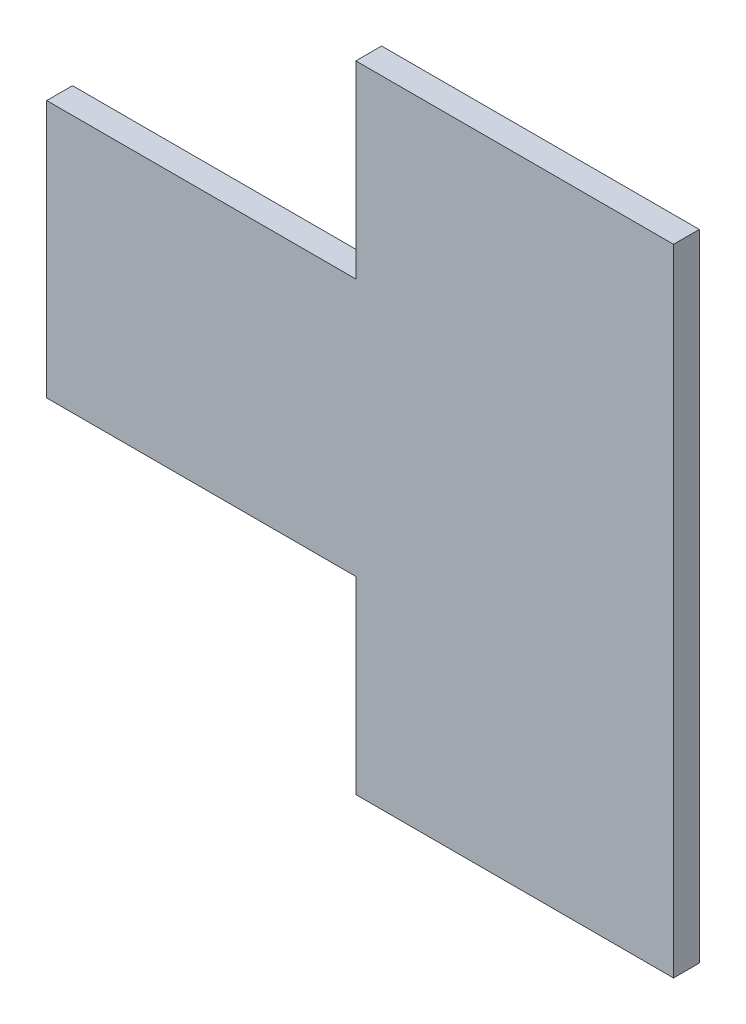
ISO-10303-21;
HEADER;
FILE_DESCRIPTION(('STEP AP214'),'2;1');
FILE_NAME('part.step','',(''),(''),'','','');
FILE_SCHEMA(('AUTOMOTIVE_DESIGN { 1 0 10303 214 1 1 1 1 }'));
ENDSEC;
DATA;
#1=APPLICATION_CONTEXT('core data for automotive mechanical design processes');
#2=APPLICATION_PROTOCOL_DEFINITION('international standard','automotive_design',2000,#1);
#3=PRODUCT_CONTEXT('',#1,'mechanical');
#4=PRODUCT('Part','Part','',(#3));
#5=PRODUCT_RELATED_PRODUCT_CATEGORY('part','',(#4));
#6=PRODUCT_DEFINITION_FORMATION('','',#4);
#7=PRODUCT_DEFINITION_CONTEXT('part definition',#1,'design');
#8=PRODUCT_DEFINITION('design','',#6,#7);
#9=PRODUCT_DEFINITION_SHAPE('','',#8);
#10=(LENGTH_UNIT() NAMED_UNIT(*) SI_UNIT(.MILLI.,.METRE.));
#11=(NAMED_UNIT(*) PLANE_ANGLE_UNIT() SI_UNIT($,.RADIAN.));
#12=(NAMED_UNIT(*) SI_UNIT($,.STERADIAN.) SOLID_ANGLE_UNIT());
#13=UNCERTAINTY_MEASURE_WITH_UNIT(LENGTH_MEASURE(1.E-05),#10,'distance_accuracy_value','');
#14=(GEOMETRIC_REPRESENTATION_CONTEXT(3) GLOBAL_UNCERTAINTY_ASSIGNED_CONTEXT((#13)) GLOBAL_UNIT_ASSIGNED_CONTEXT((#10,
#11,#12)) REPRESENTATION_CONTEXT('',''));
#15=CARTESIAN_POINT('',(0.,0.,0.));
#16=DIRECTION('',(0.,0.,1.));
#17=DIRECTION('',(1.,0.,0.));
#18=AXIS2_PLACEMENT_3D('',#15,#16,#17);
#19=CARTESIAN_POINT('',(0.,-30.,3.));
#20=DIRECTION('',(1.,0.,0.));
#21=DIRECTION('',(0.,0.,-1.));
#22=AXIS2_PLACEMENT_3D('',#19,#20,#21);
#23=PLANE('',#22);
#24=DIRECTION('',(0.,-1.,0.));
#25=VECTOR('',#24,1.);
#26=CARTESIAN_POINT('',(0.,-30.,0.));
#27=LINE('',#26,#25);
#28=CARTESIAN_POINT('',(0.,0.,0.));
#29=VERTEX_POINT('',#28);
#30=CARTESIAN_POINT('',(0.,-30.,0.));
#31=VERTEX_POINT('',#30);
#32=EDGE_CURVE('E131',#29,#31,#27,.T.);
#33=ORIENTED_EDGE('',*,*,#32,.T.);
#34=DIRECTION('',(0.,0.,-1.));
#35=VECTOR('',#34,1.);
#36=CARTESIAN_POINT('',(0.,-30.,3.));
#37=LINE('',#36,#35);
#38=CARTESIAN_POINT('',(0.,-30.,3.));
#39=VERTEX_POINT('',#38);
#40=EDGE_CURVE('E11',#39,#31,#37,.T.);
#41=ORIENTED_EDGE('',*,*,#40,.F.);
#42=DIRECTION('',(0.,-1.,0.));
#43=VECTOR('',#42,1.);
#44=CARTESIAN_POINT('',(0.,-30.,3.));
#45=LINE('',#44,#43);
#46=CARTESIAN_POINT('',(0.,0.,3.));
#47=VERTEX_POINT('',#46);
#48=EDGE_CURVE('E145',#47,#39,#45,.T.);
#49=ORIENTED_EDGE('',*,*,#48,.F.);
#50=DIRECTION('',(0.,0.,-1.));
#51=VECTOR('',#50,1.);
#52=CARTESIAN_POINT('',(0.,0.,3.));
#53=LINE('',#52,#51);
#54=EDGE_CURVE('E127',#47,#29,#53,.T.);
#55=ORIENTED_EDGE('',*,*,#54,.T.);
#56=EDGE_LOOP('',(#33,#41,#49,#55));
#57=FACE_BOUND('',#56,.T.);
#58=ADVANCED_FACE('F35',(#57),#23,.F.);
#59=CARTESIAN_POINT('',(36.,-30.,3.));
#60=DIRECTION('',(0.,1.,0.));
#61=DIRECTION('',(-1.,0.,0.));
#62=AXIS2_PLACEMENT_3D('',#59,#60,#61);
#63=PLANE('',#62);
#64=DIRECTION('',(1.,0.,0.));
#65=VECTOR('',#64,1.);
#66=CARTESIAN_POINT('',(36.,-30.,0.));
#67=LINE('',#66,#65);
#68=CARTESIAN_POINT('',(36.,-30.,0.));
#69=VERTEX_POINT('',#68);
#70=EDGE_CURVE('E134',#31,#69,#67,.T.);
#71=ORIENTED_EDGE('',*,*,#70,.T.);
#72=DIRECTION('',(0.,0.,-1.));
#73=VECTOR('',#72,1.);
#74=CARTESIAN_POINT('',(36.,-30.,3.));
#75=LINE('',#74,#73);
#76=CARTESIAN_POINT('',(36.,-30.,3.));
#77=VERTEX_POINT('',#76);
#78=EDGE_CURVE('E43',#77,#69,#75,.T.);
#79=ORIENTED_EDGE('',*,*,#78,.F.);
#80=DIRECTION('',(1.,0.,0.));
#81=VECTOR('',#80,1.);
#82=CARTESIAN_POINT('',(36.,-30.,3.));
#83=LINE('',#82,#81);
#84=EDGE_CURVE('E94',#39,#77,#83,.T.);
#85=ORIENTED_EDGE('',*,*,#84,.F.);
#86=ORIENTED_EDGE('',*,*,#40,.T.);
#87=EDGE_LOOP('',(#71,#79,#85,#86));
#88=FACE_BOUND('',#87,.T.);
#89=ADVANCED_FACE('F180',(#88),#63,.F.);
#90=CARTESIAN_POINT('',(36.,-52.,3.));
#91=DIRECTION('',(1.,0.,0.));
#92=DIRECTION('',(0.,0.,-1.));
#93=AXIS2_PLACEMENT_3D('',#90,#91,#92);
#94=PLANE('',#93);
#95=DIRECTION('',(0.,-1.,0.));
#96=VECTOR('',#95,1.);
#97=CARTESIAN_POINT('',(36.,-52.,0.));
#98=LINE('',#97,#96);
#99=CARTESIAN_POINT('',(36.,-52.,0.));
#100=VERTEX_POINT('',#99);
#101=EDGE_CURVE('E136',#69,#100,#98,.T.);
#102=ORIENTED_EDGE('',*,*,#101,.T.);
#103=DIRECTION('',(0.,0.,-1.));
#104=VECTOR('',#103,1.);
#105=CARTESIAN_POINT('',(36.,-52.,3.));
#106=LINE('',#105,#104);
#107=CARTESIAN_POINT('',(36.,-52.,3.));
#108=VERTEX_POINT('',#107);
#109=EDGE_CURVE('E152',#108,#100,#106,.T.);
#110=ORIENTED_EDGE('',*,*,#109,.F.);
#111=DIRECTION('',(0.,-1.,0.));
#112=VECTOR('',#111,1.);
#113=CARTESIAN_POINT('',(36.,-52.,3.));
#114=LINE('',#113,#112);
#115=EDGE_CURVE('E160',#77,#108,#114,.T.);
#116=ORIENTED_EDGE('',*,*,#115,.F.);
#117=ORIENTED_EDGE('',*,*,#78,.T.);
#118=EDGE_LOOP('',(#102,#110,#116,#117));
#119=FACE_BOUND('',#118,.T.);
#120=ADVANCED_FACE('F158',(#119),#94,.F.);
#121=CARTESIAN_POINT('',(73.,-52.,3.));
#122=DIRECTION('',(0.,1.,0.));
#123=DIRECTION('',(-1.,0.,0.));
#124=AXIS2_PLACEMENT_3D('',#121,#122,#123);
#125=PLANE('',#124);
#126=DIRECTION('',(1.,0.,0.));
#127=VECTOR('',#126,1.);
#128=CARTESIAN_POINT('',(73.,-52.,0.));
#129=LINE('',#128,#127);
#130=CARTESIAN_POINT('',(73.,-52.,0.));
#131=VERTEX_POINT('',#130);
#132=EDGE_CURVE('E138',#100,#131,#129,.T.);
#133=ORIENTED_EDGE('',*,*,#132,.T.);
#134=DIRECTION('',(0.,0.,-1.));
#135=VECTOR('',#134,1.);
#136=CARTESIAN_POINT('',(73.,-52.,3.));
#137=LINE('',#136,#135);
#138=CARTESIAN_POINT('',(73.,-52.,3.));
#139=VERTEX_POINT('',#138);
#140=EDGE_CURVE('E149',#139,#131,#137,.T.);
#141=ORIENTED_EDGE('',*,*,#140,.F.);
#142=DIRECTION('',(1.,0.,0.));
#143=VECTOR('',#142,1.);
#144=CARTESIAN_POINT('',(73.,-52.,3.));
#145=LINE('',#144,#143);
#146=EDGE_CURVE('E172',#108,#139,#145,.T.);
#147=ORIENTED_EDGE('',*,*,#146,.F.);
#148=ORIENTED_EDGE('',*,*,#109,.T.);
#149=EDGE_LOOP('',(#133,#141,#147,#148));
#150=FACE_BOUND('',#149,.T.);
#151=ADVANCED_FACE('F168',(#150),#125,.F.);
#152=CARTESIAN_POINT('',(73.,22.,3.));
#153=DIRECTION('',(-1.,0.,0.));
#154=DIRECTION('',(0.,-1.,0.));
#155=AXIS2_PLACEMENT_3D('',#152,#153,#154);
#156=PLANE('',#155);
#157=DIRECTION('',(0.,1.,0.));
#158=VECTOR('',#157,1.);
#159=CARTESIAN_POINT('',(73.,22.,0.));
#160=LINE('',#159,#158);
#161=CARTESIAN_POINT('',(73.,22.,0.));
#162=VERTEX_POINT('',#161);
#163=EDGE_CURVE('E140',#131,#162,#160,.T.);
#164=ORIENTED_EDGE('',*,*,#163,.T.);
#165=DIRECTION('',(0.,0.,-1.));
#166=VECTOR('',#165,1.);
#167=CARTESIAN_POINT('',(73.,22.,3.));
#168=LINE('',#167,#166);
#169=CARTESIAN_POINT('',(73.,22.,3.));
#170=VERTEX_POINT('',#169);
#171=EDGE_CURVE('E122',#170,#162,#168,.T.);
#172=ORIENTED_EDGE('',*,*,#171,.F.);
#173=DIRECTION('',(0.,1.,0.));
#174=VECTOR('',#173,1.);
#175=CARTESIAN_POINT('',(73.,22.,3.));
#176=LINE('',#175,#174);
#177=EDGE_CURVE('E113',#139,#170,#176,.T.);
#178=ORIENTED_EDGE('',*,*,#177,.F.);
#179=ORIENTED_EDGE('',*,*,#140,.T.);
#180=EDGE_LOOP('',(#164,#172,#178,#179));
#181=FACE_BOUND('',#180,.T.);
#182=ADVANCED_FACE('F171',(#181),#156,.F.);
#183=CARTESIAN_POINT('',(36.,22.,3.));
#184=DIRECTION('',(0.,-1.,0.));
#185=DIRECTION('',(0.,0.,-1.));
#186=AXIS2_PLACEMENT_3D('',#183,#184,#185);
#187=PLANE('',#186);
#188=DIRECTION('',(-1.,0.,0.));
#189=VECTOR('',#188,1.);
#190=CARTESIAN_POINT('',(36.,22.,0.));
#191=LINE('',#190,#189);
#192=CARTESIAN_POINT('',(36.,22.,0.));
#193=VERTEX_POINT('',#192);
#194=EDGE_CURVE('E121',#162,#193,#191,.T.);
#195=ORIENTED_EDGE('',*,*,#194,.T.);
#196=DIRECTION('',(0.,0.,-1.));
#197=VECTOR('',#196,1.);
#198=CARTESIAN_POINT('',(36.,22.,3.));
#199=LINE('',#198,#197);
#200=CARTESIAN_POINT('',(36.,22.,3.));
#201=VERTEX_POINT('',#200);
#202=EDGE_CURVE('E118',#201,#193,#199,.T.);
#203=ORIENTED_EDGE('',*,*,#202,.F.);
#204=DIRECTION('',(-1.,0.,0.));
#205=VECTOR('',#204,1.);
#206=CARTESIAN_POINT('',(36.,22.,3.));
#207=LINE('',#206,#205);
#208=EDGE_CURVE('E107',#170,#201,#207,.T.);
#209=ORIENTED_EDGE('',*,*,#208,.F.);
#210=ORIENTED_EDGE('',*,*,#171,.T.);
#211=EDGE_LOOP('',(#195,#203,#209,#210));
#212=FACE_BOUND('',#211,.T.);
#213=ADVANCED_FACE('F119',(#212),#187,.F.);
#214=CARTESIAN_POINT('',(36.,0.,3.));
#215=DIRECTION('',(1.,0.,0.));
#216=DIRECTION('',(0.,0.,-1.));
#217=AXIS2_PLACEMENT_3D('',#214,#215,#216);
#218=PLANE('',#217);
#219=DIRECTION('',(0.,-1.,0.));
#220=VECTOR('',#219,1.);
#221=CARTESIAN_POINT('',(36.,0.,0.));
#222=LINE('',#221,#220);
#223=CARTESIAN_POINT('',(36.,0.,0.));
#224=VERTEX_POINT('',#223);
#225=EDGE_CURVE('E80',#193,#224,#222,.T.);
#226=ORIENTED_EDGE('',*,*,#225,.T.);
#227=DIRECTION('',(0.,0.,-1.));
#228=VECTOR('',#227,1.);
#229=CARTESIAN_POINT('',(36.,0.,3.));
#230=LINE('',#229,#228);
#231=CARTESIAN_POINT('',(36.,0.,3.));
#232=VERTEX_POINT('',#231);
#233=EDGE_CURVE('E123',#232,#224,#230,.T.);
#234=ORIENTED_EDGE('',*,*,#233,.F.);
#235=DIRECTION('',(0.,-1.,0.));
#236=VECTOR('',#235,1.);
#237=CARTESIAN_POINT('',(36.,0.,3.));
#238=LINE('',#237,#236);
#239=EDGE_CURVE('E111',#201,#232,#238,.T.);
#240=ORIENTED_EDGE('',*,*,#239,.F.);
#241=ORIENTED_EDGE('',*,*,#202,.T.);
#242=EDGE_LOOP('',(#226,#234,#240,#241));
#243=FACE_BOUND('',#242,.T.);
#244=ADVANCED_FACE('F125',(#243),#218,.F.);
#245=CARTESIAN_POINT('',(0.,0.,3.));
#246=DIRECTION('',(0.,-1.,0.));
#247=DIRECTION('',(0.,0.,-1.));
#248=AXIS2_PLACEMENT_3D('',#245,#246,#247);
#249=PLANE('',#248);
#250=DIRECTION('',(-1.,0.,0.));
#251=VECTOR('',#250,1.);
#252=CARTESIAN_POINT('',(0.,0.,0.));
#253=LINE('',#252,#251);
#254=EDGE_CURVE('E86',#224,#29,#253,.T.);
#255=ORIENTED_EDGE('',*,*,#254,.T.);
#256=ORIENTED_EDGE('',*,*,#54,.F.);
#257=DIRECTION('',(-1.,0.,0.));
#258=VECTOR('',#257,1.);
#259=CARTESIAN_POINT('',(0.,0.,3.));
#260=LINE('',#259,#258);
#261=EDGE_CURVE('E51',#232,#47,#260,.T.);
#262=ORIENTED_EDGE('',*,*,#261,.F.);
#263=ORIENTED_EDGE('',*,*,#233,.T.);
#264=EDGE_LOOP('',(#255,#256,#262,#263));
#265=FACE_BOUND('',#264,.T.);
#266=ADVANCED_FACE('F196',(#265),#249,.F.);
#267=CARTESIAN_POINT('',(0.,0.,3.));
#268=DIRECTION('',(0.,0.,-1.));
#269=DIRECTION('',(-1.,0.,0.));
#270=AXIS2_PLACEMENT_3D('',#267,#268,#269);
#271=PLANE('',#270);
#272=ORIENTED_EDGE('',*,*,#48,.T.);
#273=ORIENTED_EDGE('',*,*,#84,.T.);
#274=ORIENTED_EDGE('',*,*,#115,.T.);
#275=ORIENTED_EDGE('',*,*,#146,.T.);
#276=ORIENTED_EDGE('',*,*,#177,.T.);
#277=ORIENTED_EDGE('',*,*,#208,.T.);
#278=ORIENTED_EDGE('',*,*,#239,.T.);
#279=ORIENTED_EDGE('',*,*,#261,.T.);
#280=EDGE_LOOP('',(#272,#273,#274,#275,#276,#277,#278,#279));
#281=FACE_BOUND('',#280,.T.);
#282=ADVANCED_FACE('F109',(#281),#271,.F.);
#283=CARTESIAN_POINT('',(0.,0.,0.));
#284=DIRECTION('',(0.,0.,-1.));
#285=DIRECTION('',(-1.,0.,0.));
#286=AXIS2_PLACEMENT_3D('',#283,#284,#285);
#287=PLANE('',#286);
#288=ORIENTED_EDGE('',*,*,#32,.F.);
#289=ORIENTED_EDGE('',*,*,#254,.F.);
#290=ORIENTED_EDGE('',*,*,#225,.F.);
#291=ORIENTED_EDGE('',*,*,#194,.F.);
#292=ORIENTED_EDGE('',*,*,#163,.F.);
#293=ORIENTED_EDGE('',*,*,#132,.F.);
#294=ORIENTED_EDGE('',*,*,#101,.F.);
#295=ORIENTED_EDGE('',*,*,#70,.F.);
#296=EDGE_LOOP('',(#288,#289,#290,#291,#292,#293,#294,#295));
#297=FACE_BOUND('',#296,.T.);
#298=ADVANCED_FACE('F164',(#297),#287,.T.);
#299=CLOSED_SHELL('',(#58,#89,#120,#151,#182,#213,#244,#266,#282,#298));
#300=MANIFOLD_SOLID_BREP('B2',#299);
#301=ADVANCED_BREP_SHAPE_REPRESENTATION('',(#18,#300),#14);
#302=SHAPE_DEFINITION_REPRESENTATION(#9,#301);
ENDSEC;
END-ISO-10303-21;
